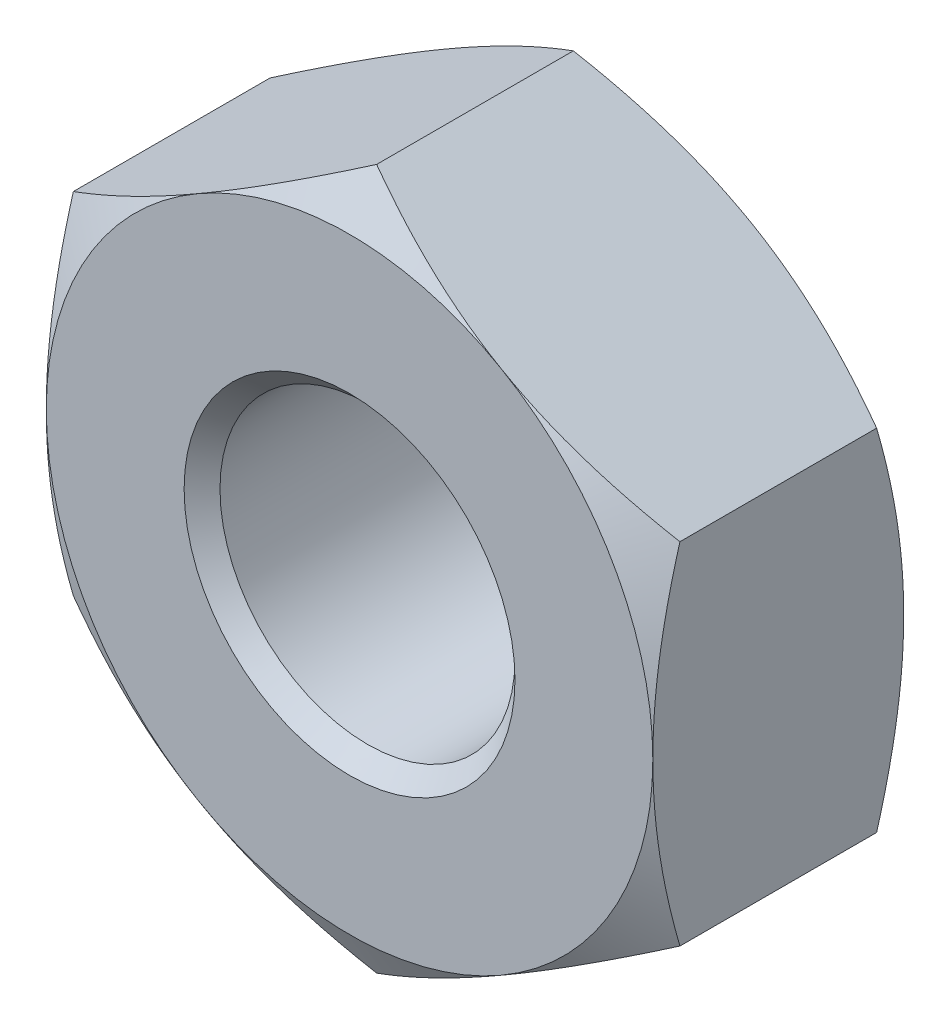
ISO-10303-21;
HEADER;
FILE_DESCRIPTION(('STEP AP214'),'2;1');
FILE_NAME('part.step','',(''),(''),'','','');
FILE_SCHEMA(('AUTOMOTIVE_DESIGN { 1 0 10303 214 1 1 1 1 }'));
ENDSEC;
DATA;
#1=APPLICATION_CONTEXT('core data for automotive mechanical design processes');
#2=APPLICATION_PROTOCOL_DEFINITION('international standard','automotive_design',2000,#1);
#3=PRODUCT_CONTEXT('',#1,'mechanical');
#4=PRODUCT('Part','Part','',(#3));
#5=PRODUCT_RELATED_PRODUCT_CATEGORY('part','',(#4));
#6=PRODUCT_DEFINITION_FORMATION('','',#4);
#7=PRODUCT_DEFINITION_CONTEXT('part definition',#1,'design');
#8=PRODUCT_DEFINITION('design','',#6,#7);
#9=PRODUCT_DEFINITION_SHAPE('','',#8);
#10=(LENGTH_UNIT() NAMED_UNIT(*) SI_UNIT(.MILLI.,.METRE.));
#11=(NAMED_UNIT(*) PLANE_ANGLE_UNIT() SI_UNIT($,.RADIAN.));
#12=(NAMED_UNIT(*) SI_UNIT($,.STERADIAN.) SOLID_ANGLE_UNIT());
#13=UNCERTAINTY_MEASURE_WITH_UNIT(LENGTH_MEASURE(1.E-05),#10,'distance_accuracy_value','');
#14=(GEOMETRIC_REPRESENTATION_CONTEXT(3) GLOBAL_UNCERTAINTY_ASSIGNED_CONTEXT((#13)) GLOBAL_UNIT_ASSIGNED_CONTEXT((#10,
#11,#12)) REPRESENTATION_CONTEXT('',''));
#15=CARTESIAN_POINT('',(0.,0.,0.));
#16=DIRECTION('',(0.,0.,1.));
#17=DIRECTION('',(1.,0.,0.));
#18=AXIS2_PLACEMENT_3D('',#15,#16,#17);
#19=CARTESIAN_POINT('',(0.,0.,2.275));
#20=DIRECTION('',(0.,0.,-1.));
#21=DIRECTION('',(-1.,0.,0.));
#22=AXIS2_PLACEMENT_3D('',#19,#20,#21);
#23=CYLINDRICAL_SURFACE('',#22,1.3375);
#24=CARTESIAN_POINT('',(0.,0.,0.162500000000001));
#25=DIRECTION('',(0.,0.,-1.));
#26=DIRECTION('',(0.,1.,0.));
#27=AXIS2_PLACEMENT_3D('',#24,#25,#26);
#28=CIRCLE('',#27,1.3375);
#29=CARTESIAN_POINT('',(0.,1.3375,0.162500000000002));
#30=VERTEX_POINT('',#29);
#31=EDGE_CURVE('E511',#30,#30,#28,.T.);
#32=ORIENTED_EDGE('',*,*,#31,.T.);
#33=EDGE_LOOP('',(#32));
#34=FACE_BOUND('',#33,.T.);
#35=CARTESIAN_POINT('',(0.,0.,2.1125));
#36=DIRECTION('',(0.,0.,-1.));
#37=DIRECTION('',(0.,1.,0.));
#38=AXIS2_PLACEMENT_3D('',#35,#36,#37);
#39=CIRCLE('',#38,1.3375);
#40=CARTESIAN_POINT('',(0.,1.3375,2.1125));
#41=VERTEX_POINT('',#40);
#42=EDGE_CURVE('E170',#41,#41,#39,.T.);
#43=ORIENTED_EDGE('',*,*,#42,.F.);
#44=EDGE_LOOP('',(#43));
#45=FACE_BOUND('',#44,.T.);
#46=ADVANCED_FACE('F33',(#34,#45),#23,.F.);
#47=CARTESIAN_POINT('',(0.,0.,2.1125));
#48=DIRECTION('',(0.,0.,1.));
#49=DIRECTION('',(0.,-1.,0.));
#50=AXIS2_PLACEMENT_3D('',#47,#48,#49);
#51=CONICAL_SURFACE('',#50,1.3375,0.785398163397443);
#52=CARTESIAN_POINT('',(0.,0.,2.275));
#53=DIRECTION('',(0.,0.,-1.));
#54=DIRECTION('',(0.,1.,0.));
#55=AXIS2_PLACEMENT_3D('',#52,#53,#54);
#56=CIRCLE('',#55,1.5);
#57=CARTESIAN_POINT('',(0.,1.5,2.275));
#58=VERTEX_POINT('',#57);
#59=EDGE_CURVE('E154',#58,#58,#56,.T.);
#60=ORIENTED_EDGE('',*,*,#59,.F.);
#61=EDGE_LOOP('',(#60));
#62=FACE_BOUND('',#61,.T.);
#63=ORIENTED_EDGE('',*,*,#42,.T.);
#64=EDGE_LOOP('',(#63));
#65=FACE_BOUND('',#64,.T.);
#66=ADVANCED_FACE('F198',(#62,#65),#51,.F.);
#67=CARTESIAN_POINT('',(0.,0.,0.));
#68=DIRECTION('',(0.,0.,-1.));
#69=DIRECTION('',(0.,1.,0.));
#70=AXIS2_PLACEMENT_3D('',#67,#68,#69);
#71=CONICAL_SURFACE('',#70,1.5,0.785398163397443);
#72=ORIENTED_EDGE('',*,*,#31,.F.);
#73=EDGE_LOOP('',(#72));
#74=FACE_BOUND('',#73,.T.);
#75=CARTESIAN_POINT('',(0.,0.,0.));
#76=DIRECTION('',(0.,0.,-1.));
#77=DIRECTION('',(0.,1.,0.));
#78=AXIS2_PLACEMENT_3D('',#75,#76,#77);
#79=CIRCLE('',#78,1.5);
#80=CARTESIAN_POINT('',(0.,1.5,0.));
#81=VERTEX_POINT('',#80);
#82=EDGE_CURVE('E514',#81,#81,#79,.T.);
#83=ORIENTED_EDGE('',*,*,#82,.T.);
#84=EDGE_LOOP('',(#83));
#85=FACE_BOUND('',#84,.T.);
#86=ADVANCED_FACE('F349',(#74,#85),#71,.F.);
#87=CARTESIAN_POINT('',(0.,0.,0.));
#88=DIRECTION('',(0.,0.,1.));
#89=DIRECTION('',(1.,0.,0.));
#90=AXIS2_PLACEMENT_3D('',#87,#88,#89);
#91=PLANE('',#90);
#92=ORIENTED_EDGE('',*,*,#82,.F.);
#93=EDGE_LOOP('',(#92));
#94=FACE_BOUND('',#93,.T.);
#95=CARTESIAN_POINT('',(0.,0.,0.));
#96=DIRECTION('',(0.,0.,-1.));
#97=DIRECTION('',(0.,1.,0.));
#98=AXIS2_PLACEMENT_3D('',#95,#96,#97);
#99=CIRCLE('',#98,2.75);
#100=CARTESIAN_POINT('',(1.375,2.38156986040721,0.));
#101=VERTEX_POINT('',#100);
#102=CARTESIAN_POINT('',(2.75,0.,0.));
#103=VERTEX_POINT('',#102);
#104=EDGE_CURVE('E163',#101,#103,#99,.T.);
#105=ORIENTED_EDGE('',*,*,#104,.T.);
#106=CARTESIAN_POINT('',(1.375,-2.38156986040721,0.));
#107=VERTEX_POINT('',#106);
#108=EDGE_CURVE('E141',#103,#107,#99,.T.);
#109=ORIENTED_EDGE('',*,*,#108,.T.);
#110=CARTESIAN_POINT('',(-1.375,-2.38156986040721,0.));
#111=VERTEX_POINT('',#110);
#112=EDGE_CURVE('E130',#107,#111,#99,.T.);
#113=ORIENTED_EDGE('',*,*,#112,.T.);
#114=CARTESIAN_POINT('',(-2.75,0.,0.));
#115=VERTEX_POINT('',#114);
#116=EDGE_CURVE('E142',#111,#115,#99,.T.);
#117=ORIENTED_EDGE('',*,*,#116,.T.);
#118=CARTESIAN_POINT('',(-1.375,2.38156986040721,0.));
#119=VERTEX_POINT('',#118);
#120=EDGE_CURVE('E516',#115,#119,#99,.T.);
#121=ORIENTED_EDGE('',*,*,#120,.T.);
#122=EDGE_CURVE('E165',#119,#101,#99,.T.);
#123=ORIENTED_EDGE('',*,*,#122,.T.);
#124=EDGE_LOOP('',(#105,#109,#113,#117,#121,#123));
#125=FACE_BOUND('',#124,.T.);
#126=ADVANCED_FACE('F161',(#94,#125),#91,.F.);
#127=CARTESIAN_POINT('',(0.,0.,2.275));
#128=DIRECTION('',(0.,0.,1.));
#129=DIRECTION('',(1.,0.,0.));
#130=AXIS2_PLACEMENT_3D('',#127,#128,#129);
#131=PLANE('',#130);
#132=CARTESIAN_POINT('',(0.,0.,2.275));
#133=DIRECTION('',(0.,0.,-1.));
#134=DIRECTION('',(0.,1.,0.));
#135=AXIS2_PLACEMENT_3D('',#132,#133,#134);
#136=CIRCLE('',#135,2.75);
#137=CARTESIAN_POINT('',(2.75,0.,2.275));
#138=VERTEX_POINT('',#137);
#139=CARTESIAN_POINT('',(1.375,-2.38156986040721,2.275));
#140=VERTEX_POINT('',#139);
#141=EDGE_CURVE('E300',#138,#140,#136,.T.);
#142=ORIENTED_EDGE('',*,*,#141,.F.);
#143=CARTESIAN_POINT('',(1.375,2.38156986040721,2.275));
#144=VERTEX_POINT('',#143);
#145=EDGE_CURVE('E168',#144,#138,#136,.T.);
#146=ORIENTED_EDGE('',*,*,#145,.F.);
#147=CARTESIAN_POINT('',(-1.375,2.38156986040721,2.275));
#148=VERTEX_POINT('',#147);
#149=EDGE_CURVE('E164',#148,#144,#136,.T.);
#150=ORIENTED_EDGE('',*,*,#149,.F.);
#151=CARTESIAN_POINT('',(-2.75,0.,2.275));
#152=VERTEX_POINT('',#151);
#153=EDGE_CURVE('E55',#152,#148,#136,.T.);
#154=ORIENTED_EDGE('',*,*,#153,.F.);
#155=CARTESIAN_POINT('',(-1.375,-2.38156986040721,2.275));
#156=VERTEX_POINT('',#155);
#157=EDGE_CURVE('E63',#156,#152,#136,.T.);
#158=ORIENTED_EDGE('',*,*,#157,.F.);
#159=EDGE_CURVE('E297',#140,#156,#136,.T.);
#160=ORIENTED_EDGE('',*,*,#159,.F.);
#161=EDGE_LOOP('',(#142,#146,#150,#154,#158,#160));
#162=FACE_BOUND('',#161,.T.);
#163=ORIENTED_EDGE('',*,*,#59,.T.);
#164=EDGE_LOOP('',(#163));
#165=FACE_BOUND('',#164,.T.);
#166=ADVANCED_FACE('F192',(#162,#165),#131,.T.);
#167=CARTESIAN_POINT('',(0.,0.,0.245620093061858));
#168=DIRECTION('',(0.,0.,1.));
#169=DIRECTION('',(0.,-1.,0.));
#170=AXIS2_PLACEMENT_3D('',#167,#168,#169);
#171=CONICAL_SURFACE('',#170,3.17542648054294,1.0471975511966);
#172=CARTESIAN_POINT('',(2.75,-4.7728249444556,1.59255708107005));
#173=CARTESIAN_POINT('',(2.75,-4.65858396642318,1.53541655163728));
#174=CARTESIAN_POINT('',(2.75,-4.5441435942014,1.47867048568091));
#175=CARTESIAN_POINT('',(2.75,-4.31477714376182,1.36615985657658));
#176=CARTESIAN_POINT('',(2.75,-4.19985105000169,1.31039532513563));
#177=CARTESIAN_POINT('',(2.75,-3.96920131985218,1.19993280976672));
#178=CARTESIAN_POINT('',(2.75,-3.85347654266311,1.14523720280531));
#179=CARTESIAN_POINT('',(2.75,-3.62135136406462,1.03729153093636));
#180=CARTESIAN_POINT('',(2.75,-3.50495095251809,0.984041487786215));
#181=CARTESIAN_POINT('',(2.75,-3.26609541459746,0.87696786101101));
#182=CARTESIAN_POINT('',(2.75,-3.14360343893142,0.823226205898875));
#183=CARTESIAN_POINT('',(2.75,-2.89757544696493,0.718190973298409));
#184=CARTESIAN_POINT('',(2.75,-2.77403946742387,0.666897310035486));
#185=CARTESIAN_POINT('',(2.75,-2.52581175013778,0.567454092383846));
#186=CARTESIAN_POINT('',(2.75,-2.40112098362694,0.519302129110333));
#187=CARTESIAN_POINT('',(2.75,-2.15023551994531,0.42695575571883));
#188=CARTESIAN_POINT('',(2.75,-2.02404041346347,0.382762451896553));
#189=CARTESIAN_POINT('',(2.75,-1.74015544179619,0.289691856371031));
#190=CARTESIAN_POINT('',(2.75,-1.58202059862525,0.242146974254289));
#191=CARTESIAN_POINT('',(2.75,-1.26300749755249,0.157534227235871));
#192=CARTESIAN_POINT('',(2.75,-1.10213091307463,0.120460198289004));
#193=CARTESIAN_POINT('',(2.75,-0.780476716937793,0.0604110115298223));
#194=CARTESIAN_POINT('',(2.75,-0.619742624513753,0.0372099993686523));
#195=CARTESIAN_POINT('',(2.75,-0.296787198188265,0.00657806439621201));
#196=CARTESIAN_POINT('',(2.75,-0.134566526019125,-0.000859562545899732));
#197=CARTESIAN_POINT('',(2.75,0.190746169681623,0.00102516229449957));
#198=CARTESIAN_POINT('',(2.75,0.353837591738494,0.0104481791130107));
#199=CARTESIAN_POINT('',(2.75,0.678358807465738,0.04498845115431));
#200=CARTESIAN_POINT('',(2.75,0.83978778805191,0.0701130468062386));
#201=CARTESIAN_POINT('',(2.75,1.16274920271514,0.133816702095932));
#202=CARTESIAN_POINT('',(2.75,1.32423644205706,0.172617928406311));
#203=CARTESIAN_POINT('',(2.75,1.64444734710296,0.260421719139857));
#204=CARTESIAN_POINT('',(2.75,1.80316940490731,0.309430017449614));
#205=CARTESIAN_POINT('',(2.75,2.08461691899805,0.40376490041576));
#206=CARTESIAN_POINT('',(2.75,2.20782965089687,0.447663702915832));
#207=CARTESIAN_POINT('',(2.75,2.45284646671014,0.539116838244372));
#208=CARTESIAN_POINT('',(2.75,2.57465092769699,0.586670165192812));
#209=CARTESIAN_POINT('',(2.75,2.81717169217558,0.684690627766133));
#210=CARTESIAN_POINT('',(2.75,2.93788719346301,0.735159736271207));
#211=CARTESIAN_POINT('',(2.75,3.17833707831199,0.838385578657612));
#212=CARTESIAN_POINT('',(2.75,3.29807143132435,0.891142383449649));
#213=CARTESIAN_POINT('',(2.75,3.53167504621102,0.996217807874883));
#214=CARTESIAN_POINT('',(2.75,3.64557842561139,1.04846081459889));
#215=CARTESIAN_POINT('',(2.75,3.8727443901906,1.15431494359639));
#216=CARTESIAN_POINT('',(2.75,3.98600698527655,1.20792604464688));
#217=CARTESIAN_POINT('',(2.75,4.21179177446543,1.31617682738221));
#218=CARTESIAN_POINT('',(2.75,4.32431492471401,1.37081451881072));
#219=CARTESIAN_POINT('',(2.75,4.54889749671872,1.48102755482585));
#220=CARTESIAN_POINT('',(2.75,4.6609569313162,1.53660287322808));
#221=CARTESIAN_POINT('',(2.75,4.7728249444556,1.59255708107005));
#222=B_SPLINE_CURVE_WITH_KNOTS('',3,(#172,#173,#174,#175,#176,#177,#178,#179,#180,#181,#182,
#183,#184,#185,#186,#187,#188,#189,#190,#191,#192,#193,#194,#195,#196,#197,#198,#199,#200,#201,
#202,#203,#204,#205,#206,#207,#208,#209,#210,#211,#212,#213,#214,#215,#216,#217,#218,#219,#220,
#221),.UNSPECIFIED.,.F.,.F.,(4,2,2,2,2,2,2,2,2,2,2,2,2,2,2,2,2,2,2,2,2,2,2,2,4),(0.,
0.383204805408724,0.766421967038965,1.15041174355791,1.53440729636712,1.93567413634183,
2.33692690608695,2.73786831099899,3.13892141657089,3.63403657129587,4.12885964820768,
4.61539059596934,5.10171458170093,5.59095181842037,6.08041794297966,6.57823225640624,
7.0763269780853,7.46866040779741,7.86088623483427,8.2533806311575,8.64588720216372,
9.02181505445849,9.39773707859043,9.7729931930379,10.1482388452848),.UNSPECIFIED.);
#223=CARTESIAN_POINT('',(2.75,1.58771324027147,0.245620093061859));
#224=VERTEX_POINT('',#223);
#225=EDGE_CURVE('E202',#103,#224,#222,.T.);
#226=ORIENTED_EDGE('',*,*,#225,.F.);
#227=ORIENTED_EDGE('',*,*,#104,.F.);
#228=CARTESIAN_POINT('',(2.7502,1.58759777021763,0.245686763364758));
#229=CARTESIAN_POINT('',(2.62935077934009,1.65737010029699,0.205387662249261));
#230=CARTESIAN_POINT('',(2.50745839737737,1.72774469983533,0.168736902597661));
#231=CARTESIAN_POINT('',(2.26156287327211,1.86971254687003,0.1047621829698));
#232=CARTESIAN_POINT('',(2.13755536142615,1.94130831721583,0.0774608556744973));
#233=CARTESIAN_POINT('',(1.89107720202406,2.08361254889599,0.0349617452941174));
#234=CARTESIAN_POINT('',(1.76864448141258,2.15429911309864,0.0194811186224586));
#235=CARTESIAN_POINT('',(1.52320285763109,2.29600490065923,0.000999397369941372));
#236=CARTESIAN_POINT('',(1.40019484676709,2.36702360884404,-0.00201700053739943));
#237=CARTESIAN_POINT('',(1.17034121338921,2.49972966594897,0.0042531454285473));
#238=CARTESIAN_POINT('',(1.06346120874598,2.56143686540073,0.0120001542767028));
#239=CARTESIAN_POINT('',(0.850397532665252,2.68444923614046,0.0365551810643549));
#240=CARTESIAN_POINT('',(0.744214598351112,2.74575398185008,0.0533715896505702));
#241=CARTESIAN_POINT('',(0.530711510606817,2.86902004703206,0.0954119223459557));
#242=CARTESIAN_POINT('',(0.423418383857146,2.93096576264318,0.12081408068723));
#243=CARTESIAN_POINT('',(0.210432520715949,3.05393320806134,0.17846722583998));
#244=CARTESIAN_POINT('',(0.104737054973348,3.11495651365995,0.21070466329898));
#245=CARTESIAN_POINT('',(-0.000199999999999753,3.17554195059678,0.245686763364758));
#246=B_SPLINE_CURVE_WITH_KNOTS('',3,(#228,#229,#230,#231,#232,#233,#234,#235,#236,#237,#238,
#239,#240,#241,#242,#243,#244,#245),.UNSPECIFIED.,.F.,.F.,(4,2,2,2,2,2,2,2,4),(0.,
0.435912828725887,0.872873557116331,1.29901931904671,1.72464171213573,2.09526089052937,
2.46622354066374,2.84541551798557,3.22386274754524),.UNSPECIFIED.);
#247=EDGE_CURVE('E295',#224,#101,#246,.T.);
#248=ORIENTED_EDGE('',*,*,#247,.F.);
#249=EDGE_LOOP('',(#226,#227,#248));
#250=FACE_BOUND('',#249,.T.);
#251=ADVANCED_FACE('F188',(#250),#171,.T.);
#252=ORIENTED_EDGE('',*,*,#108,.F.);
#253=CARTESIAN_POINT('',(2.75,-1.58771324027146,0.245620093061858));
#254=VERTEX_POINT('',#253);
#255=EDGE_CURVE('E150',#254,#103,#222,.T.);
#256=ORIENTED_EDGE('',*,*,#255,.F.);
#257=CARTESIAN_POINT('',(-0.000199999999999711,-3.17554195059678,0.245686763364757));
#258=CARTESIAN_POINT('',(0.120649220659906,-3.10576962051743,0.20538766224926));
#259=CARTESIAN_POINT('',(0.242541602622634,-3.03539502097908,0.16873690259766));
#260=CARTESIAN_POINT('',(0.488437126727893,-2.89342717394439,0.104762182969799));
#261=CARTESIAN_POINT('',(0.612444638573855,-2.82183140359858,0.0774608556744964));
#262=CARTESIAN_POINT('',(0.858922797975943,-2.67952717191842,0.0349617452941165));
#263=CARTESIAN_POINT('',(0.981355518587417,-2.60884060771577,0.0194811186224578));
#264=CARTESIAN_POINT('',(1.22679714236891,-2.46713482015519,0.000999397369940774));
#265=CARTESIAN_POINT('',(1.34980515323291,-2.39611611197038,-0.00201700053739987));
#266=CARTESIAN_POINT('',(1.57965878661079,-2.26341005486544,0.00425314542854687));
#267=CARTESIAN_POINT('',(1.68653879125402,-2.20170285541369,0.0120001542767023));
#268=CARTESIAN_POINT('',(1.89960246733475,-2.07869048467395,0.0365551810643543));
#269=CARTESIAN_POINT('',(2.00578540164889,-2.01738573896433,0.0533715896505696));
#270=CARTESIAN_POINT('',(2.21928848939318,-1.89411967378235,0.0954119223459552));
#271=CARTESIAN_POINT('',(2.32658161614285,-1.83217395817123,0.120814080687229));
#272=CARTESIAN_POINT('',(2.53956747928405,-1.70920651275308,0.17846722583998));
#273=CARTESIAN_POINT('',(2.64526294502665,-1.64818320715446,0.21070466329898));
#274=CARTESIAN_POINT('',(2.7502,-1.58759777021763,0.245686763364758));
#275=B_SPLINE_CURVE_WITH_KNOTS('',3,(#257,#258,#259,#260,#261,#262,#263,#264,#265,#266,#267,
#268,#269,#270,#271,#272,#273,#274),.UNSPECIFIED.,.F.,.F.,(4,2,2,2,2,2,2,2,4),(0.,
0.435912828725888,0.872873557116331,1.29901931904671,1.72464171213573,2.09526089052937,
2.46622354066374,2.84541551798557,3.22386274754524),.UNSPECIFIED.);
#276=EDGE_CURVE('E147',#107,#254,#275,.T.);
#277=ORIENTED_EDGE('',*,*,#276,.F.);
#278=EDGE_LOOP('',(#252,#256,#277));
#279=FACE_BOUND('',#278,.T.);
#280=ADVANCED_FACE('F148',(#279),#171,.T.);
#281=CARTESIAN_POINT('',(0.,0.,2.275));
#282=DIRECTION('',(0.,0.,-1.));
#283=DIRECTION('',(0.,1.,0.));
#284=AXIS2_PLACEMENT_3D('',#281,#282,#283);
#285=CONICAL_SURFACE('',#284,2.75,1.0471975511966);
#286=CARTESIAN_POINT('',(2.75,4.7728249444556,0.682442918929946));
#287=CARTESIAN_POINT('',(2.75,4.65858396642318,0.739583448362716));
#288=CARTESIAN_POINT('',(2.75,4.5441435942014,0.796329514319088));
#289=CARTESIAN_POINT('',(2.75,4.31477714376182,0.908840143423416));
#290=CARTESIAN_POINT('',(2.75,4.19985105000169,0.964604674864371));
#291=CARTESIAN_POINT('',(2.75,3.96920131985218,1.07506719023328));
#292=CARTESIAN_POINT('',(2.75,3.85347654266312,1.12976279719468));
#293=CARTESIAN_POINT('',(2.75,3.62135136406463,1.23770846906364));
#294=CARTESIAN_POINT('',(2.75,3.50495095251809,1.29095851221378));
#295=CARTESIAN_POINT('',(2.75,3.26609541459746,1.39803213898899));
#296=CARTESIAN_POINT('',(2.75,3.14360343893142,1.45177379410112));
#297=CARTESIAN_POINT('',(2.75,2.89757544696494,1.55680902670159));
#298=CARTESIAN_POINT('',(2.75,2.77403946742388,1.60810268996451));
#299=CARTESIAN_POINT('',(2.75,2.52581175013778,1.70754590761615));
#300=CARTESIAN_POINT('',(2.75,2.40112098362694,1.75569787088967));
#301=CARTESIAN_POINT('',(2.75,2.15023551994532,1.84804424428117));
#302=CARTESIAN_POINT('',(2.75,2.02404041346347,1.89223754810345));
#303=CARTESIAN_POINT('',(2.75,1.74015544179619,1.98530814362897));
#304=CARTESIAN_POINT('',(2.75,1.58202059862525,2.03285302574571));
#305=CARTESIAN_POINT('',(2.75,1.2630074975525,2.11746577276413));
#306=CARTESIAN_POINT('',(2.75,1.10213091307464,2.15453980171099));
#307=CARTESIAN_POINT('',(2.75,0.780476716937801,2.21458898847018));
#308=CARTESIAN_POINT('',(2.75,0.61974262451376,2.23779000063135));
#309=CARTESIAN_POINT('',(2.75,0.296787198188274,2.26842193560379));
#310=CARTESIAN_POINT('',(2.75,0.134566526019134,2.2758595625459));
#311=CARTESIAN_POINT('',(2.75,-0.190746169681614,2.2739748377055));
#312=CARTESIAN_POINT('',(2.75,-0.353837591738485,2.26455182088699));
#313=CARTESIAN_POINT('',(2.75,-0.678358807465729,2.23001154884569));
#314=CARTESIAN_POINT('',(2.75,-0.839787788051901,2.20488695319376));
#315=CARTESIAN_POINT('',(2.75,-1.16274920271513,2.14118329790407));
#316=CARTESIAN_POINT('',(2.75,-1.32423644205705,2.10238207159369));
#317=CARTESIAN_POINT('',(2.75,-1.64444734710295,2.01457828086015));
#318=CARTESIAN_POINT('',(2.75,-1.8031694049073,1.96556998255039));
#319=CARTESIAN_POINT('',(2.75,-2.08461691899804,1.87123509958424));
#320=CARTESIAN_POINT('',(2.75,-2.20782965089686,1.82733629708417));
#321=CARTESIAN_POINT('',(2.75,-2.45284646671014,1.73588316175563));
#322=CARTESIAN_POINT('',(2.75,-2.57465092769698,1.68832983480719));
#323=CARTESIAN_POINT('',(2.75,-2.81717169217558,1.59030937223387));
#324=CARTESIAN_POINT('',(2.75,-2.93788719346301,1.53984026372879));
#325=CARTESIAN_POINT('',(2.75,-3.17833707831199,1.43661442134239));
#326=CARTESIAN_POINT('',(2.75,-3.29807143132434,1.38385761655035));
#327=CARTESIAN_POINT('',(2.75,-3.53167504621101,1.27878219212512));
#328=CARTESIAN_POINT('',(2.75,-3.64557842561139,1.22653918540111));
#329=CARTESIAN_POINT('',(2.75,-3.8727443901906,1.12068505640361));
#330=CARTESIAN_POINT('',(2.75,-3.98600698527654,1.06707395535312));
#331=CARTESIAN_POINT('',(2.75,-4.21179177446543,0.958823172617785));
#332=CARTESIAN_POINT('',(2.75,-4.32431492471401,0.904185481189276));
#333=CARTESIAN_POINT('',(2.75,-4.54889749671871,0.793972445174148));
#334=CARTESIAN_POINT('',(2.75,-4.6609569313162,0.738397126771918));
#335=CARTESIAN_POINT('',(2.75,-4.7728249444556,0.682442918929944));
#336=B_SPLINE_CURVE_WITH_KNOTS('',3,(#286,#287,#288,#289,#290,#291,#292,#293,#294,#295,#296,
#297,#298,#299,#300,#301,#302,#303,#304,#305,#306,#307,#308,#309,#310,#311,#312,#313,#314,#315,
#316,#317,#318,#319,#320,#321,#322,#323,#324,#325,#326,#327,#328,#329,#330,#331,#332,#333,#334,
#335),.UNSPECIFIED.,.F.,.F.,(4,2,2,2,2,2,2,2,2,2,2,2,2,2,2,2,2,2,2,2,2,2,2,2,4),(0.,
0.383204805408724,0.766421967038966,1.15041174355791,1.53440729636711,1.93567413634183,
2.33692690608695,2.73786831099899,3.13892141657088,3.63403657129586,4.12885964820767,
4.61539059596933,5.10171458170093,5.59095181842036,6.08041794297965,6.57823225640623,
7.07632697808529,7.4686604077974,7.86088623483427,8.25338063115749,8.64588720216372,
9.02181505445848,9.39773707859042,9.77299319303789,10.1482388452848),.UNSPECIFIED.);
#337=CARTESIAN_POINT('',(2.75,-1.58771324027147,2.02937990693814));
#338=VERTEX_POINT('',#337);
#339=EDGE_CURVE('E38',#138,#338,#336,.T.);
#340=ORIENTED_EDGE('',*,*,#339,.F.);
#341=ORIENTED_EDGE('',*,*,#141,.T.);
#342=CARTESIAN_POINT('',(2.7502,-1.58759777021763,2.02931323663524));
#343=CARTESIAN_POINT('',(2.6293507793401,-1.65737010029699,2.06961233775074));
#344=CARTESIAN_POINT('',(2.50745839737737,-1.72774469983533,2.10626309740234));
#345=CARTESIAN_POINT('',(2.26156287327211,-1.86971254687003,2.1702378170302));
#346=CARTESIAN_POINT('',(2.13755536142615,-1.94130831721583,2.1975391443255));
#347=CARTESIAN_POINT('',(1.89107720202406,-2.08361254889599,2.24003825470588));
#348=CARTESIAN_POINT('',(1.76864448141259,-2.15429911309864,2.25551888137754));
#349=CARTESIAN_POINT('',(1.52320285763109,-2.29600490065923,2.27400060263006));
#350=CARTESIAN_POINT('',(1.40019484676709,-2.36702360884404,2.2770170005374));
#351=CARTESIAN_POINT('',(1.17034121338921,-2.49972966594897,2.27074685457145));
#352=CARTESIAN_POINT('',(1.06346120874598,-2.56143686540073,2.2629998457233));
#353=CARTESIAN_POINT('',(0.850397532665252,-2.68444923614047,2.23844481893565));
#354=CARTESIAN_POINT('',(0.744214598351113,-2.74575398185008,2.22162841034943));
#355=CARTESIAN_POINT('',(0.530711510606818,-2.86902004703206,2.17958807765404));
#356=CARTESIAN_POINT('',(0.423418383857146,-2.93096576264318,2.15418591931277));
#357=CARTESIAN_POINT('',(0.21043252071595,-3.05393320806134,2.09653277416002));
#358=CARTESIAN_POINT('',(0.104737054973348,-3.11495651365995,2.06429533670102));
#359=CARTESIAN_POINT('',(-0.000199999999999896,-3.17554195059678,2.02931323663524));
#360=B_SPLINE_CURVE_WITH_KNOTS('',3,(#342,#343,#344,#345,#346,#347,#348,#349,#350,#351,#352,
#353,#354,#355,#356,#357,#358,#359),.UNSPECIFIED.,.F.,.F.,(4,2,2,2,2,2,2,2,4),(0.,
0.435912828725888,0.872873557116331,1.29901931904671,1.72464171213573,2.09526089052937,
2.46622354066374,2.84541551798557,3.22386274754524),.UNSPECIFIED.);
#361=EDGE_CURVE('E290',#338,#140,#360,.T.);
#362=ORIENTED_EDGE('',*,*,#361,.F.);
#363=EDGE_LOOP('',(#340,#341,#362));
#364=FACE_BOUND('',#363,.T.);
#365=ADVANCED_FACE('F333',(#364),#285,.T.);
#366=ORIENTED_EDGE('',*,*,#145,.T.);
#367=CARTESIAN_POINT('',(2.75,1.58771324027147,2.02937990693814));
#368=VERTEX_POINT('',#367);
#369=EDGE_CURVE('E11',#368,#138,#336,.T.);
#370=ORIENTED_EDGE('',*,*,#369,.F.);
#371=CARTESIAN_POINT('',(-0.0002,3.17554195059678,2.02931323663524));
#372=CARTESIAN_POINT('',(0.120649220659906,3.10576962051743,2.06961233775074));
#373=CARTESIAN_POINT('',(0.242541602622634,3.03539502097908,2.10626309740234));
#374=CARTESIAN_POINT('',(0.488437126727892,2.89342717394439,2.1702378170302));
#375=CARTESIAN_POINT('',(0.612444638573855,2.82183140359858,2.1975391443255));
#376=CARTESIAN_POINT('',(0.858922797975943,2.67952717191842,2.24003825470588));
#377=CARTESIAN_POINT('',(0.981355518587416,2.60884060771577,2.25551888137754));
#378=CARTESIAN_POINT('',(1.22679714236891,2.46713482015519,2.27400060263006));
#379=CARTESIAN_POINT('',(1.34980515323291,2.39611611197038,2.2770170005374));
#380=CARTESIAN_POINT('',(1.57965878661079,2.26341005486544,2.27074685457145));
#381=CARTESIAN_POINT('',(1.68653879125402,2.20170285541369,2.2629998457233));
#382=CARTESIAN_POINT('',(1.89960246733475,2.07869048467395,2.23844481893565));
#383=CARTESIAN_POINT('',(2.00578540164889,2.01738573896433,2.22162841034943));
#384=CARTESIAN_POINT('',(2.21928848939318,1.89411967378235,2.17958807765405));
#385=CARTESIAN_POINT('',(2.32658161614285,1.83217395817123,2.15418591931277));
#386=CARTESIAN_POINT('',(2.53956747928405,1.70920651275308,2.09653277416002));
#387=CARTESIAN_POINT('',(2.64526294502665,1.64818320715446,2.06429533670102));
#388=CARTESIAN_POINT('',(2.7502,1.58759777021763,2.02931323663524));
#389=B_SPLINE_CURVE_WITH_KNOTS('',3,(#371,#372,#373,#374,#375,#376,#377,#378,#379,#380,#381,
#382,#383,#384,#385,#386,#387,#388),.UNSPECIFIED.,.F.,.F.,(4,2,2,2,2,2,2,2,4),(0.,
0.435912828725888,0.872873557116331,1.29901931904671,1.72464171213573,2.09526089052937,
2.46622354066374,2.84541551798557,3.22386274754524),.UNSPECIFIED.);
#390=EDGE_CURVE('E294',#144,#368,#389,.T.);
#391=ORIENTED_EDGE('',*,*,#390,.F.);
#392=EDGE_LOOP('',(#366,#370,#391));
#393=FACE_BOUND('',#392,.T.);
#394=ADVANCED_FACE('F307',(#393),#285,.T.);
#395=ORIENTED_EDGE('',*,*,#112,.F.);
#396=CARTESIAN_POINT('',(0.,-3.17542648054294,0.245620093061858));
#397=VERTEX_POINT('',#396);
#398=EDGE_CURVE('E134',#397,#107,#275,.T.);
#399=ORIENTED_EDGE('',*,*,#398,.F.);
#400=CARTESIAN_POINT('',(-2.7502,-1.58759777021763,0.245686763364757));
#401=CARTESIAN_POINT('',(-2.62935077934009,-1.65737010029699,0.205387662249261));
#402=CARTESIAN_POINT('',(-2.50745839737737,-1.72774469983533,0.16873690259766));
#403=CARTESIAN_POINT('',(-2.26156287327211,-1.86971254687003,0.104762182969799));
#404=CARTESIAN_POINT('',(-2.13755536142615,-1.94130831721583,0.0774608556744963));
#405=CARTESIAN_POINT('',(-1.89107720202406,-2.08361254889599,0.0349617452941164));
#406=CARTESIAN_POINT('',(-1.76864448141258,-2.15429911309864,0.0194811186224576));
#407=CARTESIAN_POINT('',(-1.52320285763109,-2.29600490065923,0.000999397369940416));
#408=CARTESIAN_POINT('',(-1.40019484676709,-2.36702360884404,-0.00201700053740047));
#409=CARTESIAN_POINT('',(-1.17034121338921,-2.49972966594897,0.00425314542854628));
#410=CARTESIAN_POINT('',(-1.06346120874598,-2.56143686540072,0.0120001542767018));
#411=CARTESIAN_POINT('',(-0.850397532665252,-2.68444923614046,0.0365551810643538));
#412=CARTESIAN_POINT('',(-0.744214598351112,-2.74575398185008,0.053371589650569));
#413=CARTESIAN_POINT('',(-0.530711510606817,-2.86902004703206,0.0954119223459545));
#414=CARTESIAN_POINT('',(-0.423418383857146,-2.93096576264318,0.120814080687229));
#415=CARTESIAN_POINT('',(-0.21043252071595,-3.05393320806134,0.178467225839979));
#416=CARTESIAN_POINT('',(-0.104737054973348,-3.11495651365995,0.210704663298979));
#417=CARTESIAN_POINT('',(0.000200000000000096,-3.17554195059678,0.245686763364757));
#418=B_SPLINE_CURVE_WITH_KNOTS('',3,(#400,#401,#402,#403,#404,#405,#406,#407,#408,#409,#410,
#411,#412,#413,#414,#415,#416,#417),.UNSPECIFIED.,.F.,.F.,(4,2,2,2,2,2,2,2,4),(0.,
0.435912828725888,0.87287355711633,1.29901931904671,1.72464171213573,2.09526089052937,
2.46622354066374,2.84541551798557,3.22386274754524),.UNSPECIFIED.);
#419=EDGE_CURVE('E136',#111,#397,#418,.T.);
#420=ORIENTED_EDGE('',*,*,#419,.F.);
#421=EDGE_LOOP('',(#395,#399,#420));
#422=FACE_BOUND('',#421,.T.);
#423=ADVANCED_FACE('F132',(#422),#171,.T.);
#424=CARTESIAN_POINT('',(0.,-3.17542648054294,2.02937990693814));
#425=VERTEX_POINT('',#424);
#426=EDGE_CURVE('E293',#140,#425,#360,.T.);
#427=ORIENTED_EDGE('',*,*,#426,.F.);
#428=ORIENTED_EDGE('',*,*,#159,.T.);
#429=CARTESIAN_POINT('',(0.000200000000000335,-3.17554195059678,2.02931323663524));
#430=CARTESIAN_POINT('',(-0.120649220659906,-3.10576962051743,2.06961233775074));
#431=CARTESIAN_POINT('',(-0.242541602622633,-3.03539502097908,2.10626309740234));
#432=CARTESIAN_POINT('',(-0.488437126727892,-2.89342717394439,2.1702378170302));
#433=CARTESIAN_POINT('',(-0.612444638573854,-2.82183140359858,2.1975391443255));
#434=CARTESIAN_POINT('',(-0.858922797975942,-2.67952717191843,2.24003825470588));
#435=CARTESIAN_POINT('',(-0.981355518587416,-2.60884060771577,2.25551888137754));
#436=CARTESIAN_POINT('',(-1.22679714236891,-2.46713482015519,2.27400060263006));
#437=CARTESIAN_POINT('',(-1.34980515323291,-2.39611611197038,2.2770170005374));
#438=CARTESIAN_POINT('',(-1.57965878661079,-2.26341005486544,2.27074685457145));
#439=CARTESIAN_POINT('',(-1.68653879125402,-2.20170285541369,2.2629998457233));
#440=CARTESIAN_POINT('',(-1.89960246733475,-2.07869048467395,2.23844481893565));
#441=CARTESIAN_POINT('',(-2.00578540164889,-2.01738573896433,2.22162841034943));
#442=CARTESIAN_POINT('',(-2.21928848939318,-1.89411967378235,2.17958807765405));
#443=CARTESIAN_POINT('',(-2.32658161614285,-1.83217395817123,2.15418591931277));
#444=CARTESIAN_POINT('',(-2.53956747928405,-1.70920651275308,2.09653277416002));
#445=CARTESIAN_POINT('',(-2.64526294502665,-1.64818320715446,2.06429533670102));
#446=CARTESIAN_POINT('',(-2.7502,-1.58759777021763,2.02931323663524));
#447=B_SPLINE_CURVE_WITH_KNOTS('',3,(#429,#430,#431,#432,#433,#434,#435,#436,#437,#438,#439,
#440,#441,#442,#443,#444,#445,#446),.UNSPECIFIED.,.F.,.F.,(4,2,2,2,2,2,2,2,4),(0.,
0.435912828725887,0.87287355711633,1.29901931904671,1.72464171213573,2.09526089052937,
2.46622354066374,2.84541551798557,3.22386274754524),.UNSPECIFIED.);
#448=EDGE_CURVE('E250',#425,#156,#447,.T.);
#449=ORIENTED_EDGE('',*,*,#448,.F.);
#450=EDGE_LOOP('',(#427,#428,#449));
#451=FACE_BOUND('',#450,.T.);
#452=ADVANCED_FACE('F339',(#451),#285,.T.);
#453=ORIENTED_EDGE('',*,*,#116,.F.);
#454=CARTESIAN_POINT('',(-2.75,-1.58771324027147,0.245620093061858));
#455=VERTEX_POINT('',#454);
#456=EDGE_CURVE('E519',#455,#111,#418,.T.);
#457=ORIENTED_EDGE('',*,*,#456,.F.);
#458=CARTESIAN_POINT('',(-2.75,4.7728249444556,1.59255708107005));
#459=CARTESIAN_POINT('',(-2.75,4.65858396642318,1.53541655163728));
#460=CARTESIAN_POINT('',(-2.75,4.5441435942014,1.47867048568091));
#461=CARTESIAN_POINT('',(-2.75,4.31477714376182,1.36615985657658));
#462=CARTESIAN_POINT('',(-2.75,4.19985105000169,1.31039532513563));
#463=CARTESIAN_POINT('',(-2.75,3.96920131985217,1.19993280976672));
#464=CARTESIAN_POINT('',(-2.75,3.85347654266311,1.14523720280531));
#465=CARTESIAN_POINT('',(-2.75,3.62135136406462,1.03729153093636));
#466=CARTESIAN_POINT('',(-2.75,3.50495095251809,0.984041487786216));
#467=CARTESIAN_POINT('',(-2.75,3.26609541459746,0.87696786101101));
#468=CARTESIAN_POINT('',(-2.75,3.14360343893142,0.823226205898875));
#469=CARTESIAN_POINT('',(-2.75,2.89757544696493,0.718190973298409));
#470=CARTESIAN_POINT('',(-2.75,2.77403946742387,0.666897310035486));
#471=CARTESIAN_POINT('',(-2.75,2.52581175013778,0.567454092383846));
#472=CARTESIAN_POINT('',(-2.75,2.40112098362694,0.519302129110333));
#473=CARTESIAN_POINT('',(-2.75,2.15023551994531,0.42695575571883));
#474=CARTESIAN_POINT('',(-2.75,2.02404041346347,0.382762451896553));
#475=CARTESIAN_POINT('',(-2.75,1.74015544179619,0.28969185637103));
#476=CARTESIAN_POINT('',(-2.75,1.58202059862525,0.242146974254289));
#477=CARTESIAN_POINT('',(-2.75,1.26300749755249,0.15753422723587));
#478=CARTESIAN_POINT('',(-2.75,1.10213091307463,0.120460198289004));
#479=CARTESIAN_POINT('',(-2.75,0.780476716937793,0.060411011529822));
#480=CARTESIAN_POINT('',(-2.75,0.619742624513752,0.0372099993686519));
#481=CARTESIAN_POINT('',(-2.75,0.296787198188265,0.00657806439621157));
#482=CARTESIAN_POINT('',(-2.75,0.134566526019125,-0.000859562545900198));
#483=CARTESIAN_POINT('',(-2.75,-0.190746169681623,0.00102516229449904));
#484=CARTESIAN_POINT('',(-2.75,-0.353837591738495,0.0104481791130102));
#485=CARTESIAN_POINT('',(-2.75,-0.678358807465739,0.0449884511543093));
#486=CARTESIAN_POINT('',(-2.75,-0.839787788051911,0.0701130468062379));
#487=CARTESIAN_POINT('',(-2.75,-1.16274920271514,0.133816702095932));
#488=CARTESIAN_POINT('',(-2.75,-1.32423644205707,0.172617928406311));
#489=CARTESIAN_POINT('',(-2.75,-1.64444734710296,0.260421719139857));
#490=CARTESIAN_POINT('',(-2.75,-1.80316940490731,0.309430017449614));
#491=CARTESIAN_POINT('',(-2.75,-2.08461691899805,0.403764900415759));
#492=CARTESIAN_POINT('',(-2.75,-2.20782965089687,0.447663702915832));
#493=CARTESIAN_POINT('',(-2.75,-2.45284646671014,0.539116838244372));
#494=CARTESIAN_POINT('',(-2.75,-2.57465092769699,0.586670165192812));
#495=CARTESIAN_POINT('',(-2.75,-2.81717169217559,0.684690627766133));
#496=CARTESIAN_POINT('',(-2.75,-2.93788719346302,0.735159736271206));
#497=CARTESIAN_POINT('',(-2.75,-3.17833707831199,0.838385578657611));
#498=CARTESIAN_POINT('',(-2.75,-3.29807143132435,0.891142383449648));
#499=CARTESIAN_POINT('',(-2.75,-3.53167504621102,0.996217807874882));
#500=CARTESIAN_POINT('',(-2.75,-3.64557842561139,1.04846081459888));
#501=CARTESIAN_POINT('',(-2.75,-3.8727443901906,1.15431494359639));
#502=CARTESIAN_POINT('',(-2.75,-3.98600698527655,1.20792604464688));
#503=CARTESIAN_POINT('',(-2.75,-4.21179177446543,1.31617682738221));
#504=CARTESIAN_POINT('',(-2.75,-4.32431492471401,1.37081451881072));
#505=CARTESIAN_POINT('',(-2.75,-4.54889749671872,1.48102755482585));
#506=CARTESIAN_POINT('',(-2.75,-4.6609569313162,1.53660287322808));
#507=CARTESIAN_POINT('',(-2.75,-4.7728249444556,1.59255708107005));
#508=B_SPLINE_CURVE_WITH_KNOTS('',3,(#458,#459,#460,#461,#462,#463,#464,#465,#466,#467,#468,
#469,#470,#471,#472,#473,#474,#475,#476,#477,#478,#479,#480,#481,#482,#483,#484,#485,#486,#487,
#488,#489,#490,#491,#492,#493,#494,#495,#496,#497,#498,#499,#500,#501,#502,#503,#504,#505,#506,
#507),.UNSPECIFIED.,.F.,.F.,(4,2,2,2,2,2,2,2,2,2,2,2,2,2,2,2,2,2,2,2,2,2,2,2,4),(0.,
0.383204805408725,0.766421967038966,1.15041174355791,1.53440729636712,1.93567413634183,
2.33692690608695,2.73786831099899,3.13892141657089,3.63403657129587,4.12885964820768,
4.61539059596934,5.10171458170094,5.59095181842037,6.08041794297966,6.57823225640624,
7.07632697808531,7.46866040779741,7.86088623483427,8.2533806311575,8.64588720216372,
9.02181505445849,9.39773707859043,9.7729931930379,10.1482388452848),.UNSPECIFIED.);
#509=EDGE_CURVE('E212',#115,#455,#508,.T.);
#510=ORIENTED_EDGE('',*,*,#509,.F.);
#511=EDGE_LOOP('',(#453,#457,#510));
#512=FACE_BOUND('',#511,.T.);
#513=ADVANCED_FACE('F332',(#512),#171,.T.);
#514=CARTESIAN_POINT('',(-2.75,-1.58771324027147,2.02937990693814));
#515=VERTEX_POINT('',#514);
#516=EDGE_CURVE('E264',#156,#515,#447,.T.);
#517=ORIENTED_EDGE('',*,*,#516,.F.);
#518=ORIENTED_EDGE('',*,*,#157,.T.);
#519=CARTESIAN_POINT('',(-2.75,-4.7728249444556,0.682442918929945));
#520=CARTESIAN_POINT('',(-2.75,-4.65858396642318,0.739583448362715));
#521=CARTESIAN_POINT('',(-2.75,-4.5441435942014,0.796329514319087));
#522=CARTESIAN_POINT('',(-2.75,-4.31477714376182,0.908840143423415));
#523=CARTESIAN_POINT('',(-2.75,-4.19985105000169,0.96460467486437));
#524=CARTESIAN_POINT('',(-2.75,-3.96920131985218,1.07506719023328));
#525=CARTESIAN_POINT('',(-2.75,-3.85347654266312,1.12976279719468));
#526=CARTESIAN_POINT('',(-2.75,-3.62135136406463,1.23770846906364));
#527=CARTESIAN_POINT('',(-2.75,-3.50495095251809,1.29095851221378));
#528=CARTESIAN_POINT('',(-2.75,-3.26609541459746,1.39803213898899));
#529=CARTESIAN_POINT('',(-2.75,-3.14360343893143,1.45177379410112));
#530=CARTESIAN_POINT('',(-2.75,-2.89757544696494,1.55680902670159));
#531=CARTESIAN_POINT('',(-2.75,-2.77403946742388,1.60810268996451));
#532=CARTESIAN_POINT('',(-2.75,-2.52581175013778,1.70754590761615));
#533=CARTESIAN_POINT('',(-2.75,-2.40112098362694,1.75569787088966));
#534=CARTESIAN_POINT('',(-2.75,-2.15023551994532,1.84804424428117));
#535=CARTESIAN_POINT('',(-2.75,-2.02404041346347,1.89223754810345));
#536=CARTESIAN_POINT('',(-2.75,-1.74015544179619,1.98530814362897));
#537=CARTESIAN_POINT('',(-2.75,-1.58202059862525,2.03285302574571));
#538=CARTESIAN_POINT('',(-2.75,-1.2630074975525,2.11746577276413));
#539=CARTESIAN_POINT('',(-2.75,-1.10213091307464,2.15453980171099));
#540=CARTESIAN_POINT('',(-2.75,-0.780476716937802,2.21458898847018));
#541=CARTESIAN_POINT('',(-2.75,-0.619742624513762,2.23779000063135));
#542=CARTESIAN_POINT('',(-2.75,-0.296787198188275,2.26842193560379));
#543=CARTESIAN_POINT('',(-2.75,-0.134566526019136,2.2758595625459));
#544=CARTESIAN_POINT('',(-2.75,0.190746169681611,2.2739748377055));
#545=CARTESIAN_POINT('',(-2.75,0.353837591738482,2.26455182088699));
#546=CARTESIAN_POINT('',(-2.75,0.678358807465726,2.23001154884569));
#547=CARTESIAN_POINT('',(-2.75,0.839787788051897,2.20488695319376));
#548=CARTESIAN_POINT('',(-2.75,1.16274920271513,2.14118329790407));
#549=CARTESIAN_POINT('',(-2.75,1.32423644205705,2.10238207159369));
#550=CARTESIAN_POINT('',(-2.75,1.64444734710294,2.01457828086015));
#551=CARTESIAN_POINT('',(-2.75,1.80316940490729,1.96556998255039));
#552=CARTESIAN_POINT('',(-2.75,2.08461691899804,1.87123509958425));
#553=CARTESIAN_POINT('',(-2.75,2.20782965089685,1.82733629708417));
#554=CARTESIAN_POINT('',(-2.75,2.45284646671013,1.73588316175563));
#555=CARTESIAN_POINT('',(-2.75,2.57465092769698,1.68832983480719));
#556=CARTESIAN_POINT('',(-2.75,2.81717169217558,1.59030937223387));
#557=CARTESIAN_POINT('',(-2.75,2.93788719346301,1.5398402637288));
#558=CARTESIAN_POINT('',(-2.75,3.17833707831198,1.43661442134239));
#559=CARTESIAN_POINT('',(-2.75,3.29807143132434,1.38385761655035));
#560=CARTESIAN_POINT('',(-2.75,3.53167504621101,1.27878219212512));
#561=CARTESIAN_POINT('',(-2.75,3.64557842561139,1.22653918540112));
#562=CARTESIAN_POINT('',(-2.75,3.87274439019059,1.12068505640361));
#563=CARTESIAN_POINT('',(-2.75,3.98600698527654,1.06707395535312));
#564=CARTESIAN_POINT('',(-2.75,4.21179177446543,0.958823172617787));
#565=CARTESIAN_POINT('',(-2.75,4.32431492471401,0.904185481189279));
#566=CARTESIAN_POINT('',(-2.75,4.54889749671871,0.79397244517415));
#567=CARTESIAN_POINT('',(-2.75,4.6609569313162,0.73839712677192));
#568=CARTESIAN_POINT('',(-2.75,4.7728249444556,0.682442918929946));
#569=B_SPLINE_CURVE_WITH_KNOTS('',3,(#519,#520,#521,#522,#523,#524,#525,#526,#527,#528,#529,
#530,#531,#532,#533,#534,#535,#536,#537,#538,#539,#540,#541,#542,#543,#544,#545,#546,#547,#548,
#549,#550,#551,#552,#553,#554,#555,#556,#557,#558,#559,#560,#561,#562,#563,#564,#565,#566,#567,
#568),.UNSPECIFIED.,.F.,.F.,(4,2,2,2,2,2,2,2,2,2,2,2,2,2,2,2,2,2,2,2,2,2,2,2,4),(0.,
0.383204805408723,0.766421967038965,1.15041174355791,1.53440729636711,1.93567413634183,
2.33692690608695,2.73786831099899,3.13892141657088,3.63403657129586,4.12885964820767,
4.61539059596933,5.10171458170092,5.59095181842036,6.08041794297965,6.57823225640623,
7.07632697808529,7.46866040779739,7.86088623483426,8.25338063115749,8.64588720216372,
9.02181505445848,9.39773707859042,9.77299319303789,10.1482388452848),.UNSPECIFIED.);
#570=EDGE_CURVE('E263',#515,#152,#569,.T.);
#571=ORIENTED_EDGE('',*,*,#570,.F.);
#572=EDGE_LOOP('',(#517,#518,#571));
#573=FACE_BOUND('',#572,.T.);
#574=ADVANCED_FACE('F195',(#573),#285,.T.);
#575=ORIENTED_EDGE('',*,*,#120,.F.);
#576=CARTESIAN_POINT('',(-2.75,1.58771324027147,0.245620093061859));
#577=VERTEX_POINT('',#576);
#578=EDGE_CURVE('E226',#577,#115,#508,.T.);
#579=ORIENTED_EDGE('',*,*,#578,.F.);
#580=CARTESIAN_POINT('',(0.000200000000000049,3.17554195059678,0.245686763364758));
#581=CARTESIAN_POINT('',(-0.120649220659906,3.10576962051743,0.205387662249262));
#582=CARTESIAN_POINT('',(-0.242541602622633,3.03539502097908,0.168736902597661));
#583=CARTESIAN_POINT('',(-0.488437126727892,2.89342717394439,0.1047621829698));
#584=CARTESIAN_POINT('',(-0.612444638573854,2.82183140359858,0.0774608556744972));
#585=CARTESIAN_POINT('',(-0.858922797975943,2.67952717191842,0.0349617452941172));
#586=CARTESIAN_POINT('',(-0.981355518587416,2.60884060771577,0.0194811186224585));
#587=CARTESIAN_POINT('',(-1.22679714236891,2.46713482015519,0.000999397369941539));
#588=CARTESIAN_POINT('',(-1.34980515323291,2.39611611197038,-0.00201700053739927));
#589=CARTESIAN_POINT('',(-1.57965878661079,2.26341005486544,0.00425314542854732));
#590=CARTESIAN_POINT('',(-1.68653879125402,2.20170285541369,0.0120001542767027));
#591=CARTESIAN_POINT('',(-1.89960246733475,2.07869048467395,0.0365551810643547));
#592=CARTESIAN_POINT('',(-2.00578540164889,2.01738573896434,0.0533715896505702));
#593=CARTESIAN_POINT('',(-2.21928848939318,1.89411967378235,0.0954119223459557));
#594=CARTESIAN_POINT('',(-2.32658161614285,1.83217395817123,0.12081408068723));
#595=CARTESIAN_POINT('',(-2.53956747928405,1.70920651275308,0.17846722583998));
#596=CARTESIAN_POINT('',(-2.64526294502665,1.64818320715446,0.21070466329898));
#597=CARTESIAN_POINT('',(-2.7502,1.58759777021763,0.245686763364758));
#598=B_SPLINE_CURVE_WITH_KNOTS('',3,(#580,#581,#582,#583,#584,#585,#586,#587,#588,#589,#590,
#591,#592,#593,#594,#595,#596,#597),.UNSPECIFIED.,.F.,.F.,(4,2,2,2,2,2,2,2,4),(0.,
0.435912828725887,0.87287355711633,1.29901931904671,1.72464171213573,2.09526089052937,
2.46622354066374,2.84541551798557,3.22386274754524),.UNSPECIFIED.);
#599=EDGE_CURVE('E219',#119,#577,#598,.T.);
#600=ORIENTED_EDGE('',*,*,#599,.F.);
#601=EDGE_LOOP('',(#575,#579,#600));
#602=FACE_BOUND('',#601,.T.);
#603=ADVANCED_FACE('F331',(#602),#171,.T.);
#604=ORIENTED_EDGE('',*,*,#153,.T.);
#605=CARTESIAN_POINT('',(-2.7502,1.58759777021763,2.02931323663524));
#606=CARTESIAN_POINT('',(-2.62935077934009,1.65737010029699,2.06961233775074));
#607=CARTESIAN_POINT('',(-2.50745839737737,1.72774469983533,2.10626309740234));
#608=CARTESIAN_POINT('',(-2.26156287327211,1.86971254687003,2.1702378170302));
#609=CARTESIAN_POINT('',(-2.13755536142615,1.94130831721583,2.1975391443255));
#610=CARTESIAN_POINT('',(-1.89107720202406,2.08361254889599,2.24003825470588));
#611=CARTESIAN_POINT('',(-1.76864448141258,2.15429911309864,2.25551888137754));
#612=CARTESIAN_POINT('',(-1.52320285763109,2.29600490065923,2.27400060263006));
#613=CARTESIAN_POINT('',(-1.40019484676709,2.36702360884404,2.2770170005374));
#614=CARTESIAN_POINT('',(-1.17034121338921,2.49972966594897,2.27074685457145));
#615=CARTESIAN_POINT('',(-1.06346120874598,2.56143686540073,2.2629998457233));
#616=CARTESIAN_POINT('',(-0.850397532665251,2.68444923614046,2.23844481893565));
#617=CARTESIAN_POINT('',(-0.744214598351112,2.74575398185008,2.22162841034943));
#618=CARTESIAN_POINT('',(-0.530711510606817,2.86902004703206,2.17958807765405));
#619=CARTESIAN_POINT('',(-0.423418383857146,2.93096576264318,2.15418591931277));
#620=CARTESIAN_POINT('',(-0.210432520715949,3.05393320806134,2.09653277416002));
#621=CARTESIAN_POINT('',(-0.104737054973348,3.11495651365995,2.06429533670102));
#622=CARTESIAN_POINT('',(0.000199999999999842,3.17554195059678,2.02931323663524));
#623=B_SPLINE_CURVE_WITH_KNOTS('',3,(#605,#606,#607,#608,#609,#610,#611,#612,#613,#614,#615,
#616,#617,#618,#619,#620,#621,#622),.UNSPECIFIED.,.F.,.F.,(4,2,2,2,2,2,2,2,4),(0.,
0.435912828725887,0.872873557116331,1.29901931904671,1.72464171213573,2.09526089052937,
2.46622354066374,2.84541551798557,3.22386274754524),.UNSPECIFIED.);
#624=CARTESIAN_POINT('',(-2.75,1.58771324027147,2.02937990693814));
#625=VERTEX_POINT('',#624);
#626=EDGE_CURVE('E249',#625,#148,#623,.T.);
#627=ORIENTED_EDGE('',*,*,#626,.F.);
#628=EDGE_CURVE('E256',#152,#625,#569,.T.);
#629=ORIENTED_EDGE('',*,*,#628,.F.);
#630=EDGE_LOOP('',(#604,#627,#629));
#631=FACE_BOUND('',#630,.T.);
#632=ADVANCED_FACE('F325',(#631),#285,.T.);
#633=ORIENTED_EDGE('',*,*,#122,.F.);
#634=CARTESIAN_POINT('',(0.,3.17542648054294,0.245620093061859));
#635=VERTEX_POINT('',#634);
#636=EDGE_CURVE('E225',#635,#119,#598,.T.);
#637=ORIENTED_EDGE('',*,*,#636,.F.);
#638=EDGE_CURVE('E227',#101,#635,#246,.T.);
#639=ORIENTED_EDGE('',*,*,#638,.F.);
#640=EDGE_LOOP('',(#633,#637,#639));
#641=FACE_BOUND('',#640,.T.);
#642=ADVANCED_FACE('F194',(#641),#171,.T.);
#643=ORIENTED_EDGE('',*,*,#149,.T.);
#644=CARTESIAN_POINT('',(0.,3.17542648054294,2.02937990693814));
#645=VERTEX_POINT('',#644);
#646=EDGE_CURVE('E310',#645,#144,#389,.T.);
#647=ORIENTED_EDGE('',*,*,#646,.F.);
#648=EDGE_CURVE('E241',#148,#645,#623,.T.);
#649=ORIENTED_EDGE('',*,*,#648,.F.);
#650=EDGE_LOOP('',(#643,#647,#649));
#651=FACE_BOUND('',#650,.T.);
#652=ADVANCED_FACE('F342',(#651),#285,.T.);
#653=CARTESIAN_POINT('',(2.75,-1.58771324027147,2.275));
#654=DIRECTION('',(-1.,0.,0.));
#655=DIRECTION('',(0.,-1.,0.));
#656=AXIS2_PLACEMENT_3D('',#653,#654,#655);
#657=PLANE('',#656);
#658=DIRECTION('',(0.,0.,-1.));
#659=VECTOR('',#658,1.);
#660=CARTESIAN_POINT('',(2.75,1.58771324027147,2.275));
#661=LINE('',#660,#659);
#662=EDGE_CURVE('E265',#368,#224,#661,.T.);
#663=ORIENTED_EDGE('',*,*,#662,.F.);
#664=ORIENTED_EDGE('',*,*,#369,.T.);
#665=ORIENTED_EDGE('',*,*,#339,.T.);
#666=DIRECTION('',(0.,0.,-1.));
#667=VECTOR('',#666,1.);
#668=CARTESIAN_POINT('',(2.75,-1.58771324027147,2.275));
#669=LINE('',#668,#667);
#670=EDGE_CURVE('E268',#338,#254,#669,.T.);
#671=ORIENTED_EDGE('',*,*,#670,.T.);
#672=ORIENTED_EDGE('',*,*,#255,.T.);
#673=ORIENTED_EDGE('',*,*,#225,.T.);
#674=EDGE_LOOP('',(#663,#664,#665,#671,#672,#673));
#675=FACE_BOUND('',#674,.T.);
#676=ADVANCED_FACE('F286',(#675),#657,.F.);
#677=CARTESIAN_POINT('',(0.,-3.17542648054294,2.275));
#678=DIRECTION('',(-0.5,0.866025403784439,0.));
#679=DIRECTION('',(-0.866025403784439,-0.5,0.));
#680=AXIS2_PLACEMENT_3D('',#677,#678,#679);
#681=PLANE('',#680);
#682=ORIENTED_EDGE('',*,*,#670,.F.);
#683=ORIENTED_EDGE('',*,*,#361,.T.);
#684=ORIENTED_EDGE('',*,*,#426,.T.);
#685=DIRECTION('',(0.,0.,-1.));
#686=VECTOR('',#685,1.);
#687=CARTESIAN_POINT('',(0.,-3.17542648054294,2.275));
#688=LINE('',#687,#686);
#689=EDGE_CURVE('E160',#425,#397,#688,.T.);
#690=ORIENTED_EDGE('',*,*,#689,.T.);
#691=ORIENTED_EDGE('',*,*,#398,.T.);
#692=ORIENTED_EDGE('',*,*,#276,.T.);
#693=EDGE_LOOP('',(#682,#683,#684,#690,#691,#692));
#694=FACE_BOUND('',#693,.T.);
#695=ADVANCED_FACE('F157',(#694),#681,.F.);
#696=CARTESIAN_POINT('',(-2.75,-1.58771324027147,2.275));
#697=DIRECTION('',(0.5,0.866025403784439,0.));
#698=DIRECTION('',(-0.866025403784439,0.5,0.));
#699=AXIS2_PLACEMENT_3D('',#696,#697,#698);
#700=PLANE('',#699);
#701=ORIENTED_EDGE('',*,*,#689,.F.);
#702=ORIENTED_EDGE('',*,*,#448,.T.);
#703=ORIENTED_EDGE('',*,*,#516,.T.);
#704=DIRECTION('',(0.,0.,-1.));
#705=VECTOR('',#704,1.);
#706=CARTESIAN_POINT('',(-2.75,-1.58771324027147,2.275));
#707=LINE('',#706,#705);
#708=EDGE_CURVE('E271',#515,#455,#707,.T.);
#709=ORIENTED_EDGE('',*,*,#708,.T.);
#710=ORIENTED_EDGE('',*,*,#456,.T.);
#711=ORIENTED_EDGE('',*,*,#419,.T.);
#712=EDGE_LOOP('',(#701,#702,#703,#709,#710,#711));
#713=FACE_BOUND('',#712,.T.);
#714=ADVANCED_FACE('F365',(#713),#700,.F.);
#715=CARTESIAN_POINT('',(-2.75,1.58771324027147,2.275));
#716=DIRECTION('',(1.,0.,0.));
#717=DIRECTION('',(0.,0.,-1.));
#718=AXIS2_PLACEMENT_3D('',#715,#716,#717);
#719=PLANE('',#718);
#720=ORIENTED_EDGE('',*,*,#708,.F.);
#721=ORIENTED_EDGE('',*,*,#570,.T.);
#722=ORIENTED_EDGE('',*,*,#628,.T.);
#723=DIRECTION('',(0.,0.,-1.));
#724=VECTOR('',#723,1.);
#725=CARTESIAN_POINT('',(-2.75,1.58771324027147,2.275));
#726=LINE('',#725,#724);
#727=EDGE_CURVE('E274',#625,#577,#726,.T.);
#728=ORIENTED_EDGE('',*,*,#727,.T.);
#729=ORIENTED_EDGE('',*,*,#578,.T.);
#730=ORIENTED_EDGE('',*,*,#509,.T.);
#731=EDGE_LOOP('',(#720,#721,#722,#728,#729,#730));
#732=FACE_BOUND('',#731,.T.);
#733=ADVANCED_FACE('F236',(#732),#719,.F.);
#734=CARTESIAN_POINT('',(0.,3.17542648054294,2.275));
#735=DIRECTION('',(0.5,-0.866025403784439,0.));
#736=DIRECTION('',(0.866025403784439,0.5,0.));
#737=AXIS2_PLACEMENT_3D('',#734,#735,#736);
#738=PLANE('',#737);
#739=ORIENTED_EDGE('',*,*,#727,.F.);
#740=ORIENTED_EDGE('',*,*,#626,.T.);
#741=ORIENTED_EDGE('',*,*,#648,.T.);
#742=DIRECTION('',(0.,0.,-1.));
#743=VECTOR('',#742,1.);
#744=CARTESIAN_POINT('',(0.,3.17542648054294,2.275));
#745=LINE('',#744,#743);
#746=EDGE_CURVE('E276',#645,#635,#745,.T.);
#747=ORIENTED_EDGE('',*,*,#746,.T.);
#748=ORIENTED_EDGE('',*,*,#636,.T.);
#749=ORIENTED_EDGE('',*,*,#599,.T.);
#750=EDGE_LOOP('',(#739,#740,#741,#747,#748,#749));
#751=FACE_BOUND('',#750,.T.);
#752=ADVANCED_FACE('F233',(#751),#738,.F.);
#753=CARTESIAN_POINT('',(2.75,1.58771324027147,2.275));
#754=DIRECTION('',(-0.5,-0.866025403784439,0.));
#755=DIRECTION('',(0.866025403784439,-0.5,0.));
#756=AXIS2_PLACEMENT_3D('',#753,#754,#755);
#757=PLANE('',#756);
#758=ORIENTED_EDGE('',*,*,#746,.F.);
#759=ORIENTED_EDGE('',*,*,#646,.T.);
#760=ORIENTED_EDGE('',*,*,#390,.T.);
#761=ORIENTED_EDGE('',*,*,#662,.T.);
#762=ORIENTED_EDGE('',*,*,#247,.T.);
#763=ORIENTED_EDGE('',*,*,#638,.T.);
#764=EDGE_LOOP('',(#758,#759,#760,#761,#762,#763));
#765=FACE_BOUND('',#764,.T.);
#766=ADVANCED_FACE('F35',(#765),#757,.F.);
#767=CLOSED_SHELL('',(#46,#66,#86,#126,#166,#251,#280,#365,#394,#423,#452,#513,#574,#603,#632,
#642,#652,#676,#695,#714,#733,#752,#766));
#768=MANIFOLD_SOLID_BREP('B2',#767);
#769=ADVANCED_BREP_SHAPE_REPRESENTATION('',(#18,#768),#14);
#770=SHAPE_DEFINITION_REPRESENTATION(#9,#769);
ENDSEC;
END-ISO-10303-21;
